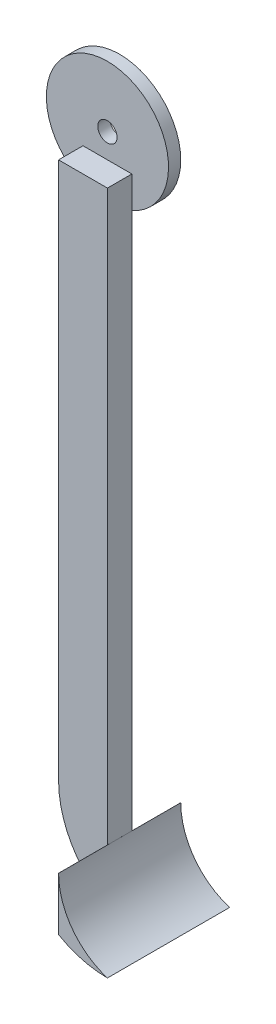
ISO-10303-21;
HEADER;
FILE_DESCRIPTION(('STEP AP214'),'2;1');
FILE_NAME('part.step','',(''),(''),'','','');
FILE_SCHEMA(('AUTOMOTIVE_DESIGN { 1 0 10303 214 1 1 1 1 }'));
ENDSEC;
DATA;
#1=APPLICATION_CONTEXT('core data for automotive mechanical design processes');
#2=APPLICATION_PROTOCOL_DEFINITION('international standard','automotive_design',2000,#1);
#3=PRODUCT_CONTEXT('',#1,'mechanical');
#4=PRODUCT('Part','Part','',(#3));
#5=PRODUCT_RELATED_PRODUCT_CATEGORY('part','',(#4));
#6=PRODUCT_DEFINITION_FORMATION('','',#4);
#7=PRODUCT_DEFINITION_CONTEXT('part definition',#1,'design');
#8=PRODUCT_DEFINITION('design','',#6,#7);
#9=PRODUCT_DEFINITION_SHAPE('','',#8);
#10=(LENGTH_UNIT() NAMED_UNIT(*) SI_UNIT(.MILLI.,.METRE.));
#11=(NAMED_UNIT(*) PLANE_ANGLE_UNIT() SI_UNIT($,.RADIAN.));
#12=(NAMED_UNIT(*) SI_UNIT($,.STERADIAN.) SOLID_ANGLE_UNIT());
#13=UNCERTAINTY_MEASURE_WITH_UNIT(LENGTH_MEASURE(1.E-05),#10,'distance_accuracy_value','');
#14=(GEOMETRIC_REPRESENTATION_CONTEXT(3) GLOBAL_UNCERTAINTY_ASSIGNED_CONTEXT((#13)) GLOBAL_UNIT_ASSIGNED_CONTEXT((#10,
#11,#12)) REPRESENTATION_CONTEXT('',''));
#15=CARTESIAN_POINT('',(0.,0.,0.));
#16=DIRECTION('',(0.,0.,1.));
#17=DIRECTION('',(1.,0.,0.));
#18=AXIS2_PLACEMENT_3D('',#15,#16,#17);
#19=CARTESIAN_POINT('',(5.,0.,7.5));
#20=DIRECTION('',(1.,0.,0.));
#21=DIRECTION('',(0.,1.,0.));
#22=AXIS2_PLACEMENT_3D('',#19,#20,#21);
#23=PLANE('',#22);
#24=DIRECTION('',(0.,-1.,0.));
#25=VECTOR('',#24,1.);
#26=CARTESIAN_POINT('',(5.,0.,7.5));
#27=LINE('',#26,#25);
#28=CARTESIAN_POINT('',(5.,-4.975,7.5));
#29=VERTEX_POINT('',#28);
#30=CARTESIAN_POINT('',(5.00000000000001,-121.403681615555,7.5));
#31=VERTEX_POINT('',#30);
#32=EDGE_CURVE('E173',#29,#31,#27,.T.);
#33=ORIENTED_EDGE('',*,*,#32,.T.);
#34=DIRECTION('',(0.,0.,1.));
#35=VECTOR('',#34,1.);
#36=CARTESIAN_POINT('',(5.00000000000001,-121.403681615555,17.5));
#37=LINE('',#36,#35);
#38=CARTESIAN_POINT('',(5.00000000000001,-121.403681615555,2.5));
#39=VERTEX_POINT('',#38);
#40=EDGE_CURVE('E250',#39,#31,#37,.T.);
#41=ORIENTED_EDGE('',*,*,#40,.F.);
#42=DIRECTION('',(0.,-1.,0.));
#43=VECTOR('',#42,1.);
#44=CARTESIAN_POINT('',(5.,0.,2.5));
#45=LINE('',#44,#43);
#46=CARTESIAN_POINT('',(5.,-11.4564392373896,2.5));
#47=VERTEX_POINT('',#46);
#48=EDGE_CURVE('E184',#47,#39,#45,.T.);
#49=ORIENTED_EDGE('',*,*,#48,.F.);
#50=CARTESIAN_POINT('',(5.,-4.975,2.5));
#51=VERTEX_POINT('',#50);
#52=EDGE_CURVE('E186',#51,#47,#45,.T.);
#53=ORIENTED_EDGE('',*,*,#52,.F.);
#54=DIRECTION('',(0.,0.,-1.));
#55=VECTOR('',#54,1.);
#56=CARTESIAN_POINT('',(5.,-4.975,7.5));
#57=LINE('',#56,#55);
#58=EDGE_CURVE('E195',#29,#51,#57,.T.);
#59=ORIENTED_EDGE('',*,*,#58,.F.);
#60=EDGE_LOOP('',(#33,#41,#49,#53,#59));
#61=FACE_BOUND('',#60,.T.);
#62=ADVANCED_FACE('F47',(#61),#23,.T.);
#63=CARTESIAN_POINT('',(0.,0.,2.5));
#64=DIRECTION('',(0.,0.,1.));
#65=DIRECTION('',(1.,0.,0.));
#66=AXIS2_PLACEMENT_3D('',#63,#64,#65);
#67=PLANE('',#66);
#68=CARTESIAN_POINT('',(0.,0.,2.5));
#69=DIRECTION('',(0.,0.,1.));
#70=DIRECTION('',(1.,0.,0.));
#71=AXIS2_PLACEMENT_3D('',#68,#69,#70);
#72=CIRCLE('',#71,1.975);
#73=CARTESIAN_POINT('',(1.975,0.,2.5));
#74=VERTEX_POINT('',#73);
#75=EDGE_CURVE('E203',#74,#74,#72,.T.);
#76=ORIENTED_EDGE('',*,*,#75,.F.);
#77=EDGE_LOOP('',(#76));
#78=FACE_BOUND('',#77,.T.);
#79=CARTESIAN_POINT('',(0.,0.,2.5));
#80=DIRECTION('',(0.,0.,1.));
#81=DIRECTION('',(1.,0.,0.));
#82=AXIS2_PLACEMENT_3D('',#79,#80,#81);
#83=CIRCLE('',#82,12.5);
#84=CARTESIAN_POINT('',(-5.,-11.4564392373896,2.5));
#85=VERTEX_POINT('',#84);
#86=EDGE_CURVE('E204',#47,#85,#83,.T.);
#87=ORIENTED_EDGE('',*,*,#86,.T.);
#88=DIRECTION('',(0.,1.,0.));
#89=VECTOR('',#88,1.);
#90=CARTESIAN_POINT('',(-5.,0.,2.5));
#91=LINE('',#90,#89);
#92=CARTESIAN_POINT('',(-5.,-4.975,2.5));
#93=VERTEX_POINT('',#92);
#94=EDGE_CURVE('E185',#85,#93,#91,.T.);
#95=ORIENTED_EDGE('',*,*,#94,.T.);
#96=DIRECTION('',(1.,0.,0.));
#97=VECTOR('',#96,1.);
#98=CARTESIAN_POINT('',(0.,-4.975,2.5));
#99=LINE('',#98,#97);
#100=EDGE_CURVE('E172',#93,#51,#99,.T.);
#101=ORIENTED_EDGE('',*,*,#100,.T.);
#102=ORIENTED_EDGE('',*,*,#52,.T.);
#103=EDGE_LOOP('',(#87,#95,#101,#102));
#104=FACE_BOUND('',#103,.T.);
#105=ADVANCED_FACE('F271',(#78,#104),#67,.T.);
#106=CARTESIAN_POINT('',(0.,0.,2.5));
#107=DIRECTION('',(0.,0.,-1.));
#108=DIRECTION('',(-1.,0.,0.));
#109=AXIS2_PLACEMENT_3D('',#106,#107,#108);
#110=CYLINDRICAL_SURFACE('',#109,12.5);
#111=EDGE_CURVE('E199',#85,#47,#83,.T.);
#112=ORIENTED_EDGE('',*,*,#111,.F.);
#113=ORIENTED_EDGE('',*,*,#86,.F.);
#114=EDGE_LOOP('',(#112,#113));
#115=FACE_BOUND('',#114,.T.);
#116=CARTESIAN_POINT('',(0.,0.,0.));
#117=DIRECTION('',(0.,0.,1.));
#118=DIRECTION('',(1.,0.,0.));
#119=AXIS2_PLACEMENT_3D('',#116,#117,#118);
#120=CIRCLE('',#119,12.5);
#121=CARTESIAN_POINT('',(12.5,0.,0.));
#122=VERTEX_POINT('',#121);
#123=EDGE_CURVE('E198',#122,#122,#120,.T.);
#124=ORIENTED_EDGE('',*,*,#123,.T.);
#125=EDGE_LOOP('',(#124));
#126=FACE_BOUND('',#125,.T.);
#127=ADVANCED_FACE('F273',(#115,#126),#110,.T.);
#128=CARTESIAN_POINT('',(0.,0.,2.5));
#129=DIRECTION('',(0.,0.,-1.));
#130=DIRECTION('',(-1.,0.,0.));
#131=AXIS2_PLACEMENT_3D('',#128,#129,#130);
#132=CYLINDRICAL_SURFACE('',#131,1.975);
#133=ORIENTED_EDGE('',*,*,#75,.T.);
#134=EDGE_LOOP('',(#133));
#135=FACE_BOUND('',#134,.T.);
#136=CARTESIAN_POINT('',(0.,0.,0.));
#137=DIRECTION('',(0.,0.,1.));
#138=DIRECTION('',(1.,0.,0.));
#139=AXIS2_PLACEMENT_3D('',#136,#137,#138);
#140=CIRCLE('',#139,1.975);
#141=CARTESIAN_POINT('',(1.975,0.,0.));
#142=VERTEX_POINT('',#141);
#143=EDGE_CURVE('E211',#142,#142,#140,.T.);
#144=ORIENTED_EDGE('',*,*,#143,.F.);
#145=EDGE_LOOP('',(#144));
#146=FACE_BOUND('',#145,.T.);
#147=ADVANCED_FACE('F276',(#135,#146),#132,.F.);
#148=CARTESIAN_POINT('',(0.,0.,0.));
#149=DIRECTION('',(0.,0.,1.));
#150=DIRECTION('',(1.,0.,0.));
#151=AXIS2_PLACEMENT_3D('',#148,#149,#150);
#152=PLANE('',#151);
#153=ORIENTED_EDGE('',*,*,#123,.F.);
#154=EDGE_LOOP('',(#153));
#155=FACE_BOUND('',#154,.T.);
#156=ORIENTED_EDGE('',*,*,#143,.T.);
#157=EDGE_LOOP('',(#156));
#158=FACE_BOUND('',#157,.T.);
#159=ADVANCED_FACE('F279',(#155,#158),#152,.F.);
#160=CARTESIAN_POINT('',(0.,0.,2.5));
#161=DIRECTION('',(0.,0.,1.));
#162=DIRECTION('',(1.,0.,0.));
#163=AXIS2_PLACEMENT_3D('',#160,#161,#162);
#164=PLANE('',#163);
#165=DIRECTION('',(0.,-1.,0.));
#166=VECTOR('',#165,1.);
#167=CARTESIAN_POINT('',(5.,0.,2.5));
#168=LINE('',#167,#166);
#169=CARTESIAN_POINT('',(5.00000000000002,-132.295508075689,2.5));
#170=VERTEX_POINT('',#169);
#171=EDGE_CURVE('E157',#39,#170,#168,.T.);
#172=ORIENTED_EDGE('',*,*,#171,.T.);
#173=CARTESIAN_POINT('',(15.,-114.975,2.5));
#174=DIRECTION('',(0.,0.,1.));
#175=DIRECTION('',(1.,0.,0.));
#176=AXIS2_PLACEMENT_3D('',#173,#174,#175);
#177=CIRCLE('',#176,20.);
#178=CARTESIAN_POINT('',(-5.,-114.975,2.5));
#179=VERTEX_POINT('',#178);
#180=EDGE_CURVE('E221',#170,#179,#177,.F.);
#181=ORIENTED_EDGE('',*,*,#180,.T.);
#182=EDGE_CURVE('E167',#179,#85,#91,.T.);
#183=ORIENTED_EDGE('',*,*,#182,.T.);
#184=ORIENTED_EDGE('',*,*,#111,.T.);
#185=ORIENTED_EDGE('',*,*,#48,.T.);
#186=EDGE_LOOP('',(#172,#181,#183,#184,#185));
#187=FACE_BOUND('',#186,.T.);
#188=ADVANCED_FACE('F238',(#187),#164,.F.);
#189=CARTESIAN_POINT('',(-5.,0.,7.5));
#190=DIRECTION('',(-1.,0.,0.));
#191=DIRECTION('',(0.,0.,1.));
#192=AXIS2_PLACEMENT_3D('',#189,#190,#191);
#193=PLANE('',#192);
#194=ORIENTED_EDGE('',*,*,#182,.F.);
#195=DIRECTION('',(0.,0.,-1.));
#196=VECTOR('',#195,1.);
#197=CARTESIAN_POINT('',(-5.,-114.975,7.5));
#198=LINE('',#197,#196);
#199=CARTESIAN_POINT('',(-5.,-114.975,7.5));
#200=VERTEX_POINT('',#199);
#201=EDGE_CURVE('E224',#179,#200,#198,.F.);
#202=ORIENTED_EDGE('',*,*,#201,.T.);
#203=DIRECTION('',(0.,1.,0.));
#204=VECTOR('',#203,1.);
#205=CARTESIAN_POINT('',(-5.,0.,7.5));
#206=LINE('',#205,#204);
#207=CARTESIAN_POINT('',(-5.,-4.975,7.5));
#208=VERTEX_POINT('',#207);
#209=EDGE_CURVE('E168',#200,#208,#206,.T.);
#210=ORIENTED_EDGE('',*,*,#209,.T.);
#211=DIRECTION('',(0.,0.,-1.));
#212=VECTOR('',#211,1.);
#213=CARTESIAN_POINT('',(-5.,-4.975,7.5));
#214=LINE('',#213,#212);
#215=EDGE_CURVE('E181',#208,#93,#214,.T.);
#216=ORIENTED_EDGE('',*,*,#215,.T.);
#217=ORIENTED_EDGE('',*,*,#94,.F.);
#218=EDGE_LOOP('',(#194,#202,#210,#216,#217));
#219=FACE_BOUND('',#218,.T.);
#220=ADVANCED_FACE('F266',(#219),#193,.T.);
#221=CARTESIAN_POINT('',(0.,-4.975,7.5));
#222=DIRECTION('',(0.,1.,0.));
#223=DIRECTION('',(0.,0.,1.));
#224=AXIS2_PLACEMENT_3D('',#221,#222,#223);
#225=PLANE('',#224);
#226=ORIENTED_EDGE('',*,*,#100,.F.);
#227=ORIENTED_EDGE('',*,*,#215,.F.);
#228=DIRECTION('',(1.,0.,0.));
#229=VECTOR('',#228,1.);
#230=CARTESIAN_POINT('',(0.,-4.975,7.5));
#231=LINE('',#230,#229);
#232=EDGE_CURVE('E177',#208,#29,#231,.T.);
#233=ORIENTED_EDGE('',*,*,#232,.T.);
#234=ORIENTED_EDGE('',*,*,#58,.T.);
#235=EDGE_LOOP('',(#226,#227,#233,#234));
#236=FACE_BOUND('',#235,.T.);
#237=ADVANCED_FACE('F301',(#236),#225,.T.);
#238=CARTESIAN_POINT('',(0.,0.,7.5));
#239=DIRECTION('',(0.,0.,1.));
#240=DIRECTION('',(1.,0.,0.));
#241=AXIS2_PLACEMENT_3D('',#238,#239,#240);
#242=PLANE('',#241);
#243=ORIENTED_EDGE('',*,*,#209,.F.);
#244=CARTESIAN_POINT('',(15.,-114.975,7.5));
#245=DIRECTION('',(0.,0.,1.));
#246=DIRECTION('',(1.,0.,0.));
#247=AXIS2_PLACEMENT_3D('',#244,#245,#246);
#248=CIRCLE('',#247,20.);
#249=CARTESIAN_POINT('',(5.00000000000002,-132.295508075689,7.5));
#250=VERTEX_POINT('',#249);
#251=EDGE_CURVE('E70',#200,#250,#248,.T.);
#252=ORIENTED_EDGE('',*,*,#251,.T.);
#253=EDGE_CURVE('E171',#31,#250,#27,.T.);
#254=ORIENTED_EDGE('',*,*,#253,.F.);
#255=ORIENTED_EDGE('',*,*,#32,.F.);
#256=ORIENTED_EDGE('',*,*,#232,.F.);
#257=EDGE_LOOP('',(#243,#252,#254,#255,#256));
#258=FACE_BOUND('',#257,.T.);
#259=ADVANCED_FACE('F308',(#258),#242,.T.);
#260=CARTESIAN_POINT('',(5.,0.,0.));
#261=DIRECTION('',(-1.,0.,0.));
#262=DIRECTION('',(0.,-1.,0.));
#263=AXIS2_PLACEMENT_3D('',#260,#261,#262);
#264=PLANE('',#263);
#265=DIRECTION('',(0.,1.,0.));
#266=VECTOR('',#265,1.);
#267=CARTESIAN_POINT('',(5.00000000000001,-121.403681615555,-7.5));
#268=LINE('',#267,#266);
#269=CARTESIAN_POINT('',(5.00000000000002,-132.295508075689,-7.5));
#270=VERTEX_POINT('',#269);
#271=CARTESIAN_POINT('',(5.00000000000001,-121.403681615555,-7.5));
#272=VERTEX_POINT('',#271);
#273=EDGE_CURVE('E138',#270,#272,#268,.T.);
#274=ORIENTED_EDGE('',*,*,#273,.F.);
#275=DIRECTION('',(0.,0.,-1.));
#276=VECTOR('',#275,1.);
#277=CARTESIAN_POINT('',(5.00000000000002,-132.295508075689,-7.5));
#278=LINE('',#277,#276);
#279=EDGE_CURVE('E218',#270,#170,#278,.F.);
#280=ORIENTED_EDGE('',*,*,#279,.T.);
#281=ORIENTED_EDGE('',*,*,#171,.F.);
#282=EDGE_CURVE('E248',#272,#39,#37,.T.);
#283=ORIENTED_EDGE('',*,*,#282,.F.);
#284=EDGE_LOOP('',(#274,#280,#281,#283));
#285=FACE_BOUND('',#284,.T.);
#286=ADVANCED_FACE('F247',(#285),#264,.T.);
#287=CARTESIAN_POINT('',(15.,-121.403681615555,-7.5));
#288=DIRECTION('',(0.,0.,1.));
#289=DIRECTION('',(0.,-1.,0.));
#290=AXIS2_PLACEMENT_3D('',#287,#288,#289);
#291=PLANE('',#290);
#292=CARTESIAN_POINT('',(19.2142138110652,-121.4036816,-7.5));
#293=DIRECTION('',(0.,0.,-1.));
#294=DIRECTION('',(0.,-1.,0.));
#295=AXIS2_PLACEMENT_3D('',#292,#293,#294);
#296=CIRCLE('',#295,14.2105693467768);
#297=CARTESIAN_POINT('',(15.,-134.975,-7.5));
#298=VERTEX_POINT('',#297);
#299=CARTESIAN_POINT('',(5.00364446428846,-121.4036816,-7.5));
#300=VERTEX_POINT('',#299);
#301=EDGE_CURVE('E132',#298,#300,#296,.T.);
#302=ORIENTED_EDGE('',*,*,#301,.F.);
#303=CARTESIAN_POINT('',(15.,-114.975,-7.5));
#304=DIRECTION('',(0.,0.,1.));
#305=DIRECTION('',(0.,-1.,0.));
#306=AXIS2_PLACEMENT_3D('',#303,#304,#305);
#307=CIRCLE('',#306,20.);
#308=EDGE_CURVE('E215',#298,#270,#307,.F.);
#309=ORIENTED_EDGE('',*,*,#308,.T.);
#310=ORIENTED_EDGE('',*,*,#273,.T.);
#311=DIRECTION('',(-1.,0.,0.));
#312=VECTOR('',#311,1.);
#313=CARTESIAN_POINT('',(15.,-121.403681615555,-7.5));
#314=LINE('',#313,#312);
#315=EDGE_CURVE('E152',#300,#272,#314,.T.);
#316=ORIENTED_EDGE('',*,*,#315,.F.);
#317=EDGE_LOOP('',(#302,#309,#310,#316));
#318=FACE_BOUND('',#317,.T.);
#319=ADVANCED_FACE('F260',(#318),#291,.F.);
#320=CARTESIAN_POINT('',(15.,-121.403681615555,17.5));
#321=DIRECTION('',(0.,-1.,0.));
#322=DIRECTION('',(1.,0.,0.));
#323=AXIS2_PLACEMENT_3D('',#320,#321,#322);
#324=PLANE('',#323);
#325=DIRECTION('',(-1.,0.,0.));
#326=VECTOR('',#325,1.);
#327=CARTESIAN_POINT('',(15.,-121.403681615555,17.5));
#328=LINE('',#327,#326);
#329=CARTESIAN_POINT('',(5.00364446428846,-121.4036816,17.5));
#330=VERTEX_POINT('',#329);
#331=CARTESIAN_POINT('',(5.00000000000001,-121.403681615555,17.5));
#332=VERTEX_POINT('',#331);
#333=EDGE_CURVE('E142',#330,#332,#328,.T.);
#334=ORIENTED_EDGE('',*,*,#333,.F.);
#335=DIRECTION('',(0.,0.,-1.));
#336=VECTOR('',#335,1.);
#337=CARTESIAN_POINT('',(5.00364446428846,-121.4036816,17.5));
#338=LINE('',#337,#336);
#339=EDGE_CURVE('E125',#330,#300,#338,.T.);
#340=ORIENTED_EDGE('',*,*,#339,.T.);
#341=ORIENTED_EDGE('',*,*,#315,.T.);
#342=ORIENTED_EDGE('',*,*,#282,.T.);
#343=ORIENTED_EDGE('',*,*,#40,.T.);
#344=EDGE_CURVE('E150',#31,#332,#37,.T.);
#345=ORIENTED_EDGE('',*,*,#344,.T.);
#346=EDGE_LOOP('',(#334,#340,#341,#342,#343,#345));
#347=FACE_BOUND('',#346,.T.);
#348=ADVANCED_FACE('F147',(#347),#324,.F.);
#349=CARTESIAN_POINT('',(15.,-134.975,17.5));
#350=DIRECTION('',(0.,0.,-1.));
#351=DIRECTION('',(-1.,0.,0.));
#352=AXIS2_PLACEMENT_3D('',#349,#350,#351);
#353=PLANE('',#352);
#354=DIRECTION('',(0.,-1.,0.));
#355=VECTOR('',#354,1.);
#356=CARTESIAN_POINT('',(5.00000000000002,-134.975,17.5));
#357=LINE('',#356,#355);
#358=CARTESIAN_POINT('',(5.00000000000002,-132.295508075689,17.5));
#359=VERTEX_POINT('',#358);
#360=EDGE_CURVE('E159',#332,#359,#357,.T.);
#361=ORIENTED_EDGE('',*,*,#360,.T.);
#362=CARTESIAN_POINT('',(15.,-114.975,17.5));
#363=DIRECTION('',(0.,0.,-1.));
#364=DIRECTION('',(-1.,0.,0.));
#365=AXIS2_PLACEMENT_3D('',#362,#363,#364);
#366=CIRCLE('',#365,20.);
#367=CARTESIAN_POINT('',(15.,-134.975,17.5));
#368=VERTEX_POINT('',#367);
#369=EDGE_CURVE('E11',#359,#368,#366,.F.);
#370=ORIENTED_EDGE('',*,*,#369,.T.);
#371=CARTESIAN_POINT('',(19.2142138110652,-121.4036816,17.5));
#372=DIRECTION('',(0.,0.,-1.));
#373=DIRECTION('',(0.,-1.,0.));
#374=AXIS2_PLACEMENT_3D('',#371,#372,#373);
#375=CIRCLE('',#374,14.2105693467768);
#376=EDGE_CURVE('E129',#368,#330,#375,.T.);
#377=ORIENTED_EDGE('',*,*,#376,.T.);
#378=ORIENTED_EDGE('',*,*,#333,.T.);
#379=EDGE_LOOP('',(#361,#370,#377,#378));
#380=FACE_BOUND('',#379,.T.);
#381=ADVANCED_FACE('F141',(#380),#353,.F.);
#382=ORIENTED_EDGE('',*,*,#253,.T.);
#383=DIRECTION('',(0.,0.,-1.));
#384=VECTOR('',#383,1.);
#385=CARTESIAN_POINT('',(5.00000000000002,-132.295508075689,7.5));
#386=LINE('',#385,#384);
#387=EDGE_CURVE('E56',#250,#359,#386,.F.);
#388=ORIENTED_EDGE('',*,*,#387,.T.);
#389=ORIENTED_EDGE('',*,*,#360,.F.);
#390=ORIENTED_EDGE('',*,*,#344,.F.);
#391=EDGE_LOOP('',(#382,#388,#389,#390));
#392=FACE_BOUND('',#391,.T.);
#393=ADVANCED_FACE('F319',(#392),#264,.T.);
#394=CARTESIAN_POINT('',(19.2142138110652,-121.4036816,17.5));
#395=DIRECTION('',(0.,0.,-1.));
#396=DIRECTION('',(0.,1.,0.));
#397=AXIS2_PLACEMENT_3D('',#394,#395,#396);
#398=CYLINDRICAL_SURFACE('',#397,14.2105693467768);
#399=ORIENTED_EDGE('',*,*,#301,.T.);
#400=ORIENTED_EDGE('',*,*,#339,.F.);
#401=ORIENTED_EDGE('',*,*,#376,.F.);
#402=DIRECTION('',(0.,0.,-1.));
#403=VECTOR('',#402,1.);
#404=CARTESIAN_POINT('',(15.,-134.975,2.5));
#405=LINE('',#404,#403);
#406=EDGE_CURVE('E153',#368,#298,#405,.T.);
#407=ORIENTED_EDGE('',*,*,#406,.T.);
#408=EDGE_LOOP('',(#399,#400,#401,#407));
#409=FACE_BOUND('',#408,.T.);
#410=ADVANCED_FACE('F127',(#409),#398,.F.);
#411=CARTESIAN_POINT('',(15.,-114.975,7.5));
#412=DIRECTION('',(0.,0.,-1.));
#413=DIRECTION('',(-1.,0.,0.));
#414=AXIS2_PLACEMENT_3D('',#411,#412,#413);
#415=CYLINDRICAL_SURFACE('',#414,20.);
#416=ORIENTED_EDGE('',*,*,#251,.F.);
#417=ORIENTED_EDGE('',*,*,#201,.F.);
#418=ORIENTED_EDGE('',*,*,#180,.F.);
#419=ORIENTED_EDGE('',*,*,#279,.F.);
#420=ORIENTED_EDGE('',*,*,#308,.F.);
#421=ORIENTED_EDGE('',*,*,#406,.F.);
#422=ORIENTED_EDGE('',*,*,#369,.F.);
#423=ORIENTED_EDGE('',*,*,#387,.F.);
#424=EDGE_LOOP('',(#416,#417,#418,#419,#420,#421,#422,#423));
#425=FACE_BOUND('',#424,.T.);
#426=ADVANCED_FACE('F49',(#425),#415,.T.);
#427=CLOSED_SHELL('',(#62,#105,#127,#147,#159,#188,#220,#237,#259,#286,#319,#348,#381,#393,#410,#426));
#428=MANIFOLD_SOLID_BREP('B2',#427);
#429=ADVANCED_BREP_SHAPE_REPRESENTATION('',(#18,#428),#14);
#430=SHAPE_DEFINITION_REPRESENTATION(#9,#429);
ENDSEC;
END-ISO-10303-21;
